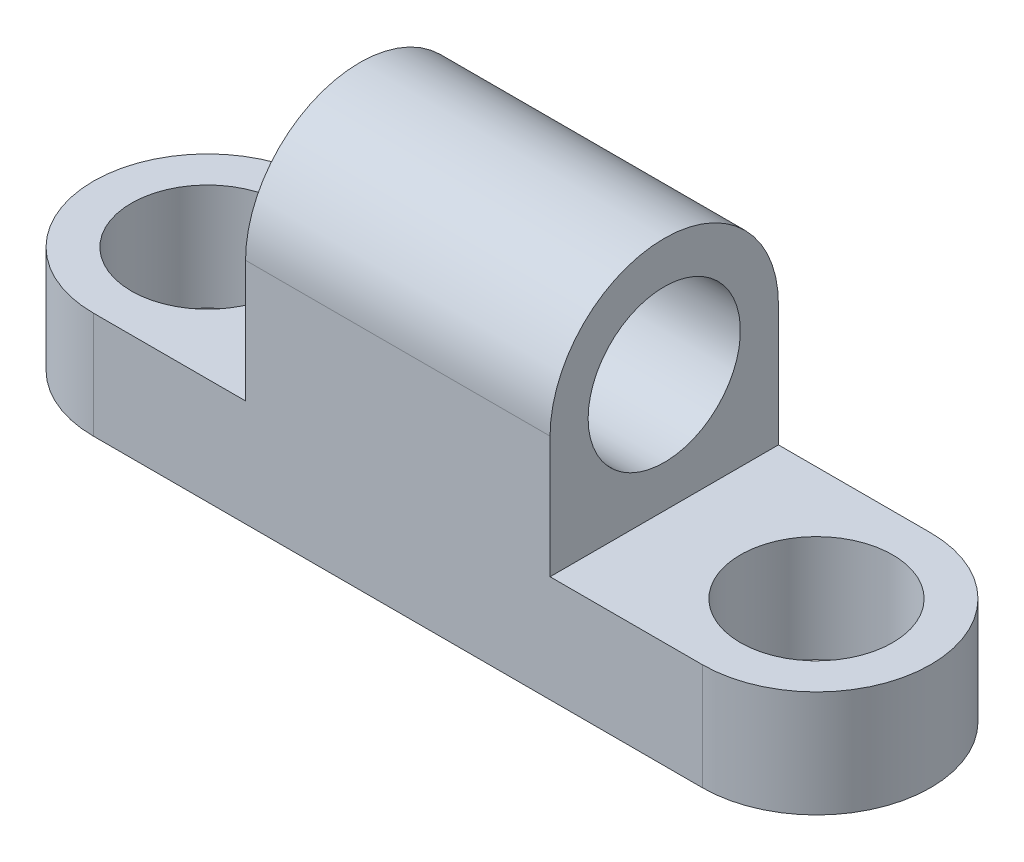
ISO-10303-21;
HEADER;
FILE_DESCRIPTION(('STEP AP214'),'2;1');
FILE_NAME('part.step','',(''),(''),'','','');
FILE_SCHEMA(('AUTOMOTIVE_DESIGN { 1 0 10303 214 1 1 1 1 }'));
ENDSEC;
DATA;
#1=APPLICATION_CONTEXT('core data for automotive mechanical design processes');
#2=APPLICATION_PROTOCOL_DEFINITION('international standard','automotive_design',2000,#1);
#3=PRODUCT_CONTEXT('',#1,'mechanical');
#4=PRODUCT('Part','Part','',(#3));
#5=PRODUCT_RELATED_PRODUCT_CATEGORY('part','',(#4));
#6=PRODUCT_DEFINITION_FORMATION('','',#4);
#7=PRODUCT_DEFINITION_CONTEXT('part definition',#1,'design');
#8=PRODUCT_DEFINITION('design','',#6,#7);
#9=PRODUCT_DEFINITION_SHAPE('','',#8);
#10=(LENGTH_UNIT() NAMED_UNIT(*) SI_UNIT(.MILLI.,.METRE.));
#11=(NAMED_UNIT(*) PLANE_ANGLE_UNIT() SI_UNIT($,.RADIAN.));
#12=(NAMED_UNIT(*) SI_UNIT($,.STERADIAN.) SOLID_ANGLE_UNIT());
#13=UNCERTAINTY_MEASURE_WITH_UNIT(LENGTH_MEASURE(1.E-05),#10,'distance_accuracy_value','');
#14=(GEOMETRIC_REPRESENTATION_CONTEXT(3) GLOBAL_UNCERTAINTY_ASSIGNED_CONTEXT((#13)) GLOBAL_UNIT_ASSIGNED_CONTEXT((#10,
#11,#12)) REPRESENTATION_CONTEXT('',''));
#15=CARTESIAN_POINT('',(0.,0.,0.));
#16=DIRECTION('',(0.,0.,1.));
#17=DIRECTION('',(1.,0.,0.));
#18=AXIS2_PLACEMENT_3D('',#15,#16,#17);
#19=CARTESIAN_POINT('',(0.,14.,-15.));
#20=DIRECTION('',(0.,1.,0.));
#21=DIRECTION('',(0.,0.,1.));
#22=AXIS2_PLACEMENT_3D('',#19,#20,#21);
#23=PLANE('',#22);
#24=CARTESIAN_POINT('',(0.,14.,-15.));
#25=DIRECTION('',(0.,1.,0.));
#26=DIRECTION('',(0.,0.,1.));
#27=AXIS2_PLACEMENT_3D('',#24,#25,#26);
#28=CIRCLE('',#27,10.);
#29=CARTESIAN_POINT('',(0.,14.,-5.));
#30=VERTEX_POINT('',#29);
#31=EDGE_CURVE('E173',#30,#30,#28,.T.);
#32=ORIENTED_EDGE('',*,*,#31,.F.);
#33=EDGE_LOOP('',(#32));
#34=FACE_BOUND('',#33,.T.);
#35=DIRECTION('',(0.,0.,1.));
#36=VECTOR('',#35,1.);
#37=CARTESIAN_POINT('',(20.,14.,-30.));
#38=LINE('',#37,#36);
#39=CARTESIAN_POINT('',(20.,14.,-30.));
#40=VERTEX_POINT('',#39);
#41=CARTESIAN_POINT('',(20.,14.,0.));
#42=VERTEX_POINT('',#41);
#43=EDGE_CURVE('E112',#40,#42,#38,.T.);
#44=ORIENTED_EDGE('',*,*,#43,.F.);
#45=DIRECTION('',(-1.,0.,0.));
#46=VECTOR('',#45,1.);
#47=CARTESIAN_POINT('',(80.,14.,-30.));
#48=LINE('',#47,#46);
#49=CARTESIAN_POINT('',(0.,14.,-30.));
#50=VERTEX_POINT('',#49);
#51=EDGE_CURVE('E150',#40,#50,#48,.T.);
#52=ORIENTED_EDGE('',*,*,#51,.T.);
#53=CARTESIAN_POINT('',(0.,14.,-15.));
#54=DIRECTION('',(0.,1.,0.));
#55=DIRECTION('',(0.,0.,1.));
#56=AXIS2_PLACEMENT_3D('',#53,#54,#55);
#57=CIRCLE('',#56,15.);
#58=CARTESIAN_POINT('',(0.,14.,0.));
#59=VERTEX_POINT('',#58);
#60=EDGE_CURVE('E149',#50,#59,#57,.T.);
#61=ORIENTED_EDGE('',*,*,#60,.T.);
#62=DIRECTION('',(1.,0.,0.));
#63=VECTOR('',#62,1.);
#64=CARTESIAN_POINT('',(0.,14.,0.));
#65=LINE('',#64,#63);
#66=EDGE_CURVE('E64',#59,#42,#65,.T.);
#67=ORIENTED_EDGE('',*,*,#66,.T.);
#68=EDGE_LOOP('',(#44,#52,#61,#67));
#69=FACE_BOUND('',#68,.T.);
#70=ADVANCED_FACE('F39',(#34,#69),#23,.T.);
#71=CARTESIAN_POINT('',(80.,14.,-30.));
#72=DIRECTION('',(0.,0.,1.));
#73=DIRECTION('',(1.,0.,0.));
#74=AXIS2_PLACEMENT_3D('',#71,#72,#73);
#75=PLANE('',#74);
#76=DIRECTION('',(-1.,0.,0.));
#77=VECTOR('',#76,1.);
#78=CARTESIAN_POINT('',(80.,0.,-30.));
#79=LINE('',#78,#77);
#80=CARTESIAN_POINT('',(80.,0.,-30.));
#81=VERTEX_POINT('',#80);
#82=CARTESIAN_POINT('',(0.,0.,-30.));
#83=VERTEX_POINT('',#82);
#84=EDGE_CURVE('E114',#81,#83,#79,.T.);
#85=ORIENTED_EDGE('',*,*,#84,.T.);
#86=DIRECTION('',(0.,-1.,0.));
#87=VECTOR('',#86,1.);
#88=CARTESIAN_POINT('',(0.,14.,-30.));
#89=LINE('',#88,#87);
#90=EDGE_CURVE('E11',#50,#83,#89,.T.);
#91=ORIENTED_EDGE('',*,*,#90,.F.);
#92=ORIENTED_EDGE('',*,*,#51,.F.);
#93=DIRECTION('',(0.,-1.,0.));
#94=VECTOR('',#93,1.);
#95=CARTESIAN_POINT('',(20.,30.,-30.));
#96=LINE('',#95,#94);
#97=CARTESIAN_POINT('',(20.,30.,-30.));
#98=VERTEX_POINT('',#97);
#99=EDGE_CURVE('E139',#98,#40,#96,.T.);
#100=ORIENTED_EDGE('',*,*,#99,.F.);
#101=DIRECTION('',(-1.,0.,0.));
#102=VECTOR('',#101,1.);
#103=CARTESIAN_POINT('',(60.,30.,-30.));
#104=LINE('',#103,#102);
#105=CARTESIAN_POINT('',(60.,30.,-30.));
#106=VERTEX_POINT('',#105);
#107=EDGE_CURVE('E124',#106,#98,#104,.T.);
#108=ORIENTED_EDGE('',*,*,#107,.F.);
#109=DIRECTION('',(0.,-1.,0.));
#110=VECTOR('',#109,1.);
#111=CARTESIAN_POINT('',(60.,30.,-30.));
#112=LINE('',#111,#110);
#113=CARTESIAN_POINT('',(60.,14.,-30.));
#114=VERTEX_POINT('',#113);
#115=EDGE_CURVE('E143',#106,#114,#112,.T.);
#116=ORIENTED_EDGE('',*,*,#115,.T.);
#117=CARTESIAN_POINT('',(80.,14.,-30.));
#118=VERTEX_POINT('',#117);
#119=EDGE_CURVE('E147',#118,#114,#48,.T.);
#120=ORIENTED_EDGE('',*,*,#119,.F.);
#121=DIRECTION('',(0.,-1.,0.));
#122=VECTOR('',#121,1.);
#123=CARTESIAN_POINT('',(80.,14.,-30.));
#124=LINE('',#123,#122);
#125=EDGE_CURVE('E156',#118,#81,#124,.T.);
#126=ORIENTED_EDGE('',*,*,#125,.T.);
#127=EDGE_LOOP('',(#85,#91,#92,#100,#108,#116,#120,#126));
#128=FACE_BOUND('',#127,.T.);
#129=ADVANCED_FACE('F41',(#128),#75,.F.);
#130=CARTESIAN_POINT('',(0.,14.,-15.));
#131=DIRECTION('',(0.,-1.,0.));
#132=DIRECTION('',(0.,0.,-1.));
#133=AXIS2_PLACEMENT_3D('',#130,#131,#132);
#134=CYLINDRICAL_SURFACE('',#133,15.);
#135=CARTESIAN_POINT('',(0.,0.,-15.));
#136=DIRECTION('',(0.,1.,0.));
#137=DIRECTION('',(0.,0.,1.));
#138=AXIS2_PLACEMENT_3D('',#135,#136,#137);
#139=CIRCLE('',#138,15.);
#140=CARTESIAN_POINT('',(0.,0.,0.));
#141=VERTEX_POINT('',#140);
#142=EDGE_CURVE('E159',#83,#141,#139,.T.);
#143=ORIENTED_EDGE('',*,*,#142,.T.);
#144=DIRECTION('',(0.,-1.,0.));
#145=VECTOR('',#144,1.);
#146=CARTESIAN_POINT('',(0.,14.,0.));
#147=LINE('',#146,#145);
#148=EDGE_CURVE('E48',#59,#141,#147,.T.);
#149=ORIENTED_EDGE('',*,*,#148,.F.);
#150=ORIENTED_EDGE('',*,*,#60,.F.);
#151=ORIENTED_EDGE('',*,*,#90,.T.);
#152=EDGE_LOOP('',(#143,#149,#150,#151));
#153=FACE_BOUND('',#152,.T.);
#154=ADVANCED_FACE('F211',(#153),#134,.T.);
#155=CARTESIAN_POINT('',(0.,14.,0.));
#156=DIRECTION('',(0.,0.,-1.));
#157=DIRECTION('',(-1.,0.,0.));
#158=AXIS2_PLACEMENT_3D('',#155,#156,#157);
#159=PLANE('',#158);
#160=DIRECTION('',(1.,0.,0.));
#161=VECTOR('',#160,1.);
#162=CARTESIAN_POINT('',(0.,0.,0.));
#163=LINE('',#162,#161);
#164=CARTESIAN_POINT('',(80.,0.,0.));
#165=VERTEX_POINT('',#164);
#166=EDGE_CURVE('E161',#141,#165,#163,.T.);
#167=ORIENTED_EDGE('',*,*,#166,.T.);
#168=DIRECTION('',(0.,-1.,0.));
#169=VECTOR('',#168,1.);
#170=CARTESIAN_POINT('',(80.,14.,0.));
#171=LINE('',#170,#169);
#172=CARTESIAN_POINT('',(80.,14.,0.));
#173=VERTEX_POINT('',#172);
#174=EDGE_CURVE('E167',#173,#165,#171,.T.);
#175=ORIENTED_EDGE('',*,*,#174,.F.);
#176=CARTESIAN_POINT('',(60.,14.,0.));
#177=VERTEX_POINT('',#176);
#178=EDGE_CURVE('E152',#177,#173,#65,.T.);
#179=ORIENTED_EDGE('',*,*,#178,.F.);
#180=DIRECTION('',(0.,-1.,0.));
#181=VECTOR('',#180,1.);
#182=CARTESIAN_POINT('',(60.,30.,0.));
#183=LINE('',#182,#181);
#184=CARTESIAN_POINT('',(60.,30.,0.));
#185=VERTEX_POINT('',#184);
#186=EDGE_CURVE('E115',#185,#177,#183,.T.);
#187=ORIENTED_EDGE('',*,*,#186,.F.);
#188=DIRECTION('',(1.,0.,0.));
#189=VECTOR('',#188,1.);
#190=CARTESIAN_POINT('',(20.,30.,0.));
#191=LINE('',#190,#189);
#192=CARTESIAN_POINT('',(20.,30.,0.));
#193=VERTEX_POINT('',#192);
#194=EDGE_CURVE('E118',#193,#185,#191,.T.);
#195=ORIENTED_EDGE('',*,*,#194,.F.);
#196=DIRECTION('',(0.,-1.,0.));
#197=VECTOR('',#196,1.);
#198=CARTESIAN_POINT('',(20.,30.,0.));
#199=LINE('',#198,#197);
#200=EDGE_CURVE('E106',#193,#42,#199,.T.);
#201=ORIENTED_EDGE('',*,*,#200,.T.);
#202=ORIENTED_EDGE('',*,*,#66,.F.);
#203=ORIENTED_EDGE('',*,*,#148,.T.);
#204=EDGE_LOOP('',(#167,#175,#179,#187,#195,#201,#202,#203));
#205=FACE_BOUND('',#204,.T.);
#206=ADVANCED_FACE('F119',(#205),#159,.F.);
#207=CARTESIAN_POINT('',(80.,14.,-15.));
#208=DIRECTION('',(0.,-1.,0.));
#209=DIRECTION('',(0.,0.,-1.));
#210=AXIS2_PLACEMENT_3D('',#207,#208,#209);
#211=CYLINDRICAL_SURFACE('',#210,15.);
#212=CARTESIAN_POINT('',(80.,0.,-15.));
#213=DIRECTION('',(0.,1.,0.));
#214=DIRECTION('',(0.,0.,1.));
#215=AXIS2_PLACEMENT_3D('',#212,#213,#214);
#216=CIRCLE('',#215,15.);
#217=EDGE_CURVE('E163',#165,#81,#216,.T.);
#218=ORIENTED_EDGE('',*,*,#217,.T.);
#219=ORIENTED_EDGE('',*,*,#125,.F.);
#220=CARTESIAN_POINT('',(80.,14.,-15.));
#221=DIRECTION('',(0.,1.,0.));
#222=DIRECTION('',(0.,0.,1.));
#223=AXIS2_PLACEMENT_3D('',#220,#221,#222);
#224=CIRCLE('',#223,15.);
#225=EDGE_CURVE('E154',#173,#118,#224,.T.);
#226=ORIENTED_EDGE('',*,*,#225,.F.);
#227=ORIENTED_EDGE('',*,*,#174,.T.);
#228=EDGE_LOOP('',(#218,#219,#226,#227));
#229=FACE_BOUND('',#228,.T.);
#230=ADVANCED_FACE('F193',(#229),#211,.T.);
#231=CARTESIAN_POINT('',(80.,14.,-15.));
#232=DIRECTION('',(0.,1.,0.));
#233=DIRECTION('',(0.,0.,1.));
#234=AXIS2_PLACEMENT_3D('',#231,#232,#233);
#235=CIRCLE('',#234,9.99999999999999);
#236=CARTESIAN_POINT('',(80.,14.,-5.00000000000001));
#237=VERTEX_POINT('',#236);
#238=EDGE_CURVE('E182',#237,#237,#235,.T.);
#239=ORIENTED_EDGE('',*,*,#238,.F.);
#240=EDGE_LOOP('',(#239));
#241=FACE_BOUND('',#240,.T.);
#242=DIRECTION('',(0.,0.,-1.));
#243=VECTOR('',#242,1.);
#244=CARTESIAN_POINT('',(60.,14.,-30.));
#245=LINE('',#244,#243);
#246=EDGE_CURVE('E56',#177,#114,#245,.T.);
#247=ORIENTED_EDGE('',*,*,#246,.F.);
#248=ORIENTED_EDGE('',*,*,#178,.T.);
#249=ORIENTED_EDGE('',*,*,#225,.T.);
#250=ORIENTED_EDGE('',*,*,#119,.T.);
#251=EDGE_LOOP('',(#247,#248,#249,#250));
#252=FACE_BOUND('',#251,.T.);
#253=ADVANCED_FACE('F190',(#241,#252),#23,.T.);
#254=CARTESIAN_POINT('',(0.,0.,-15.));
#255=DIRECTION('',(0.,1.,0.));
#256=DIRECTION('',(0.,0.,1.));
#257=AXIS2_PLACEMENT_3D('',#254,#255,#256);
#258=PLANE('',#257);
#259=CARTESIAN_POINT('',(80.,0.,-15.));
#260=DIRECTION('',(0.,1.,0.));
#261=DIRECTION('',(0.,0.,1.));
#262=AXIS2_PLACEMENT_3D('',#259,#260,#261);
#263=CIRCLE('',#262,9.99999999999999);
#264=CARTESIAN_POINT('',(80.,0.,-5.00000000000001));
#265=VERTEX_POINT('',#264);
#266=EDGE_CURVE('E43',#265,#265,#263,.T.);
#267=ORIENTED_EDGE('',*,*,#266,.T.);
#268=EDGE_LOOP('',(#267));
#269=FACE_BOUND('',#268,.T.);
#270=CARTESIAN_POINT('',(0.,0.,-15.));
#271=DIRECTION('',(0.,1.,0.));
#272=DIRECTION('',(0.,0.,1.));
#273=AXIS2_PLACEMENT_3D('',#270,#271,#272);
#274=CIRCLE('',#273,10.);
#275=CARTESIAN_POINT('',(0.,0.,-5.));
#276=VERTEX_POINT('',#275);
#277=EDGE_CURVE('E171',#276,#276,#274,.T.);
#278=ORIENTED_EDGE('',*,*,#277,.T.);
#279=EDGE_LOOP('',(#278));
#280=FACE_BOUND('',#279,.T.);
#281=ORIENTED_EDGE('',*,*,#84,.F.);
#282=ORIENTED_EDGE('',*,*,#217,.F.);
#283=ORIENTED_EDGE('',*,*,#166,.F.);
#284=ORIENTED_EDGE('',*,*,#142,.F.);
#285=EDGE_LOOP('',(#281,#282,#283,#284));
#286=FACE_BOUND('',#285,.T.);
#287=ADVANCED_FACE('F192',(#269,#280,#286),#258,.F.);
#288=CARTESIAN_POINT('',(20.,30.,-30.));
#289=DIRECTION('',(1.,0.,0.));
#290=DIRECTION('',(0.,0.,-1.));
#291=AXIS2_PLACEMENT_3D('',#288,#289,#290);
#292=PLANE('',#291);
#293=CARTESIAN_POINT('',(20.,29.5,-15.));
#294=DIRECTION('',(-1.,0.,0.));
#295=DIRECTION('',(0.,0.,1.));
#296=AXIS2_PLACEMENT_3D('',#293,#294,#295);
#297=CIRCLE('',#296,10.);
#298=CARTESIAN_POINT('',(20.,29.5,-5.));
#299=VERTEX_POINT('',#298);
#300=EDGE_CURVE('E134',#299,#299,#297,.T.);
#301=ORIENTED_EDGE('',*,*,#300,.F.);
#302=EDGE_LOOP('',(#301));
#303=FACE_BOUND('',#302,.T.);
#304=ORIENTED_EDGE('',*,*,#200,.F.);
#305=CARTESIAN_POINT('',(20.,30.,-15.));
#306=DIRECTION('',(-1.,0.,0.));
#307=DIRECTION('',(0.,0.,1.));
#308=AXIS2_PLACEMENT_3D('',#305,#306,#307);
#309=CIRCLE('',#308,15.);
#310=EDGE_CURVE('E111',#193,#98,#309,.T.);
#311=ORIENTED_EDGE('',*,*,#310,.T.);
#312=ORIENTED_EDGE('',*,*,#99,.T.);
#313=ORIENTED_EDGE('',*,*,#43,.T.);
#314=EDGE_LOOP('',(#304,#311,#312,#313));
#315=FACE_BOUND('',#314,.T.);
#316=ADVANCED_FACE('F108',(#303,#315),#292,.F.);
#317=CARTESIAN_POINT('',(60.,30.,-30.));
#318=DIRECTION('',(-1.,0.,0.));
#319=DIRECTION('',(0.,0.,1.));
#320=AXIS2_PLACEMENT_3D('',#317,#318,#319);
#321=PLANE('',#320);
#322=CARTESIAN_POINT('',(60.,29.5,-15.));
#323=DIRECTION('',(-1.,0.,0.));
#324=DIRECTION('',(0.,0.,1.));
#325=AXIS2_PLACEMENT_3D('',#322,#323,#324);
#326=CIRCLE('',#325,10.);
#327=CARTESIAN_POINT('',(60.,29.5,-5.));
#328=VERTEX_POINT('',#327);
#329=EDGE_CURVE('E130',#328,#328,#326,.T.);
#330=ORIENTED_EDGE('',*,*,#329,.T.);
#331=EDGE_LOOP('',(#330));
#332=FACE_BOUND('',#331,.T.);
#333=ORIENTED_EDGE('',*,*,#115,.F.);
#334=CARTESIAN_POINT('',(60.,30.,-15.));
#335=DIRECTION('',(-1.,0.,0.));
#336=DIRECTION('',(0.,0.,1.));
#337=AXIS2_PLACEMENT_3D('',#334,#335,#336);
#338=CIRCLE('',#337,15.);
#339=EDGE_CURVE('E129',#185,#106,#338,.T.);
#340=ORIENTED_EDGE('',*,*,#339,.F.);
#341=ORIENTED_EDGE('',*,*,#186,.T.);
#342=ORIENTED_EDGE('',*,*,#246,.T.);
#343=EDGE_LOOP('',(#333,#340,#341,#342));
#344=FACE_BOUND('',#343,.T.);
#345=ADVANCED_FACE('F227',(#332,#344),#321,.F.);
#346=CARTESIAN_POINT('',(60.,30.,-15.));
#347=DIRECTION('',(-1.,0.,0.));
#348=DIRECTION('',(0.,0.,1.));
#349=AXIS2_PLACEMENT_3D('',#346,#347,#348);
#350=CYLINDRICAL_SURFACE('',#349,15.);
#351=ORIENTED_EDGE('',*,*,#339,.T.);
#352=ORIENTED_EDGE('',*,*,#107,.T.);
#353=ORIENTED_EDGE('',*,*,#310,.F.);
#354=ORIENTED_EDGE('',*,*,#194,.T.);
#355=EDGE_LOOP('',(#351,#352,#353,#354));
#356=FACE_BOUND('',#355,.T.);
#357=ADVANCED_FACE('F127',(#356),#350,.T.);
#358=CARTESIAN_POINT('',(116.,29.5,-15.));
#359=DIRECTION('',(-1.,0.,0.));
#360=DIRECTION('',(0.,0.,1.));
#361=AXIS2_PLACEMENT_3D('',#358,#359,#360);
#362=CYLINDRICAL_SURFACE('',#361,10.);
#363=ORIENTED_EDGE('',*,*,#300,.T.);
#364=EDGE_LOOP('',(#363));
#365=FACE_BOUND('',#364,.T.);
#366=ORIENTED_EDGE('',*,*,#329,.F.);
#367=EDGE_LOOP('',(#366));
#368=FACE_BOUND('',#367,.T.);
#369=ADVANCED_FACE('F235',(#365,#368),#362,.F.);
#370=CARTESIAN_POINT('',(0.,-82.,-15.));
#371=DIRECTION('',(0.,1.,0.));
#372=DIRECTION('',(0.,0.,1.));
#373=AXIS2_PLACEMENT_3D('',#370,#371,#372);
#374=CYLINDRICAL_SURFACE('',#373,10.);
#375=ORIENTED_EDGE('',*,*,#31,.T.);
#376=EDGE_LOOP('',(#375));
#377=FACE_BOUND('',#376,.T.);
#378=ORIENTED_EDGE('',*,*,#277,.F.);
#379=EDGE_LOOP('',(#378));
#380=FACE_BOUND('',#379,.T.);
#381=ADVANCED_FACE('F240',(#377,#380),#374,.F.);
#382=CARTESIAN_POINT('',(80.,-82.,-15.));
#383=DIRECTION('',(0.,1.,0.));
#384=DIRECTION('',(0.,0.,1.));
#385=AXIS2_PLACEMENT_3D('',#382,#383,#384);
#386=CYLINDRICAL_SURFACE('',#385,9.99999999999999);
#387=ORIENTED_EDGE('',*,*,#238,.T.);
#388=EDGE_LOOP('',(#387));
#389=FACE_BOUND('',#388,.T.);
#390=ORIENTED_EDGE('',*,*,#266,.F.);
#391=EDGE_LOOP('',(#390));
#392=FACE_BOUND('',#391,.T.);
#393=ADVANCED_FACE('F187',(#389,#392),#386,.F.);
#394=CLOSED_SHELL('',(#70,#129,#154,#206,#230,#253,#287,#316,#345,#357,#369,#381,#393));
#395=MANIFOLD_SOLID_BREP('B2',#394);
#396=ADVANCED_BREP_SHAPE_REPRESENTATION('',(#18,#395),#14);
#397=SHAPE_DEFINITION_REPRESENTATION(#9,#396);
ENDSEC;
END-ISO-10303-21;
